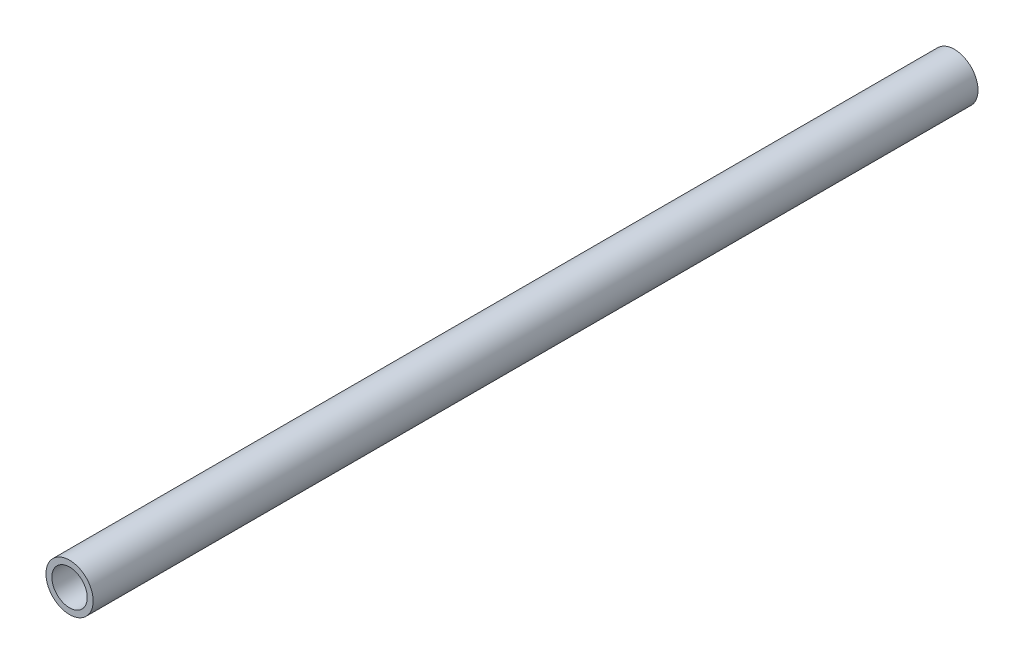
ISO-10303-21;
HEADER;
FILE_DESCRIPTION(('STEP AP214'),'2;1');
FILE_NAME('part.step','',(''),(''),'','','');
FILE_SCHEMA(('AUTOMOTIVE_DESIGN { 1 0 10303 214 1 1 1 1 }'));
ENDSEC;
DATA;
#1=APPLICATION_CONTEXT('core data for automotive mechanical design processes');
#2=APPLICATION_PROTOCOL_DEFINITION('international standard','automotive_design',2000,#1);
#3=PRODUCT_CONTEXT('',#1,'mechanical');
#4=PRODUCT('Part','Part','',(#3));
#5=PRODUCT_RELATED_PRODUCT_CATEGORY('part','',(#4));
#6=PRODUCT_DEFINITION_FORMATION('','',#4);
#7=PRODUCT_DEFINITION_CONTEXT('part definition',#1,'design');
#8=PRODUCT_DEFINITION('design','',#6,#7);
#9=PRODUCT_DEFINITION_SHAPE('','',#8);
#10=(LENGTH_UNIT() NAMED_UNIT(*) SI_UNIT(.MILLI.,.METRE.));
#11=(NAMED_UNIT(*) PLANE_ANGLE_UNIT() SI_UNIT($,.RADIAN.));
#12=(NAMED_UNIT(*) SI_UNIT($,.STERADIAN.) SOLID_ANGLE_UNIT());
#13=UNCERTAINTY_MEASURE_WITH_UNIT(LENGTH_MEASURE(1.E-05),#10,'distance_accuracy_value','');
#14=(GEOMETRIC_REPRESENTATION_CONTEXT(3) GLOBAL_UNCERTAINTY_ASSIGNED_CONTEXT((#13)) GLOBAL_UNIT_ASSIGNED_CONTEXT((#10,
#11,#12)) REPRESENTATION_CONTEXT('',''));
#15=CARTESIAN_POINT('',(0.,0.,0.));
#16=DIRECTION('',(0.,0.,1.));
#17=DIRECTION('',(1.,0.,0.));
#18=AXIS2_PLACEMENT_3D('',#15,#16,#17);
#19=CARTESIAN_POINT('',(0.,0.,150.));
#20=DIRECTION('',(0.,0.,1.));
#21=DIRECTION('',(1.,0.,0.));
#22=AXIS2_PLACEMENT_3D('',#19,#20,#21);
#23=PLANE('',#22);
#24=CARTESIAN_POINT('',(0.,0.,150.));
#25=DIRECTION('',(0.,0.,1.));
#26=DIRECTION('',(1.,0.,0.));
#27=AXIS2_PLACEMENT_3D('',#24,#25,#26);
#28=CIRCLE('',#27,4.);
#29=CARTESIAN_POINT('',(4.,0.,150.));
#30=VERTEX_POINT('',#29);
#31=EDGE_CURVE('E10',#30,#30,#28,.T.);
#32=ORIENTED_EDGE('',*,*,#31,.T.);
#33=EDGE_LOOP('',(#32));
#34=FACE_BOUND('',#33,.T.);
#35=CARTESIAN_POINT('',(0.,0.,150.));
#36=DIRECTION('',(0.,0.,1.));
#37=DIRECTION('',(1.,0.,0.));
#38=AXIS2_PLACEMENT_3D('',#35,#36,#37);
#39=CIRCLE('',#38,3.);
#40=CARTESIAN_POINT('',(3.,0.,150.));
#41=VERTEX_POINT('',#40);
#42=EDGE_CURVE('E49',#41,#41,#39,.T.);
#43=ORIENTED_EDGE('',*,*,#42,.F.);
#44=EDGE_LOOP('',(#43));
#45=FACE_BOUND('',#44,.T.);
#46=ADVANCED_FACE('F38',(#34,#45),#23,.T.);
#47=CARTESIAN_POINT('',(0.,0.,0.));
#48=DIRECTION('',(0.,0.,1.));
#49=DIRECTION('',(1.,0.,0.));
#50=AXIS2_PLACEMENT_3D('',#47,#48,#49);
#51=PLANE('',#50);
#52=CARTESIAN_POINT('',(0.,0.,0.));
#53=DIRECTION('',(0.,0.,1.));
#54=DIRECTION('',(1.,0.,0.));
#55=AXIS2_PLACEMENT_3D('',#52,#53,#54);
#56=CIRCLE('',#55,4.);
#57=CARTESIAN_POINT('',(4.,0.,0.));
#58=VERTEX_POINT('',#57);
#59=EDGE_CURVE('E42',#58,#58,#56,.T.);
#60=ORIENTED_EDGE('',*,*,#59,.F.);
#61=EDGE_LOOP('',(#60));
#62=FACE_BOUND('',#61,.T.);
#63=CARTESIAN_POINT('',(0.,0.,0.));
#64=DIRECTION('',(0.,0.,1.));
#65=DIRECTION('',(1.,0.,0.));
#66=AXIS2_PLACEMENT_3D('',#63,#64,#65);
#67=CIRCLE('',#66,3.);
#68=CARTESIAN_POINT('',(3.,0.,0.));
#69=VERTEX_POINT('',#68);
#70=EDGE_CURVE('E51',#69,#69,#67,.T.);
#71=ORIENTED_EDGE('',*,*,#70,.T.);
#72=EDGE_LOOP('',(#71));
#73=FACE_BOUND('',#72,.T.);
#74=ADVANCED_FACE('F61',(#62,#73),#51,.F.);
#75=CARTESIAN_POINT('',(0.,0.,150.));
#76=DIRECTION('',(0.,0.,-1.));
#77=DIRECTION('',(-1.,0.,0.));
#78=AXIS2_PLACEMENT_3D('',#75,#76,#77);
#79=CYLINDRICAL_SURFACE('',#78,4.);
#80=ORIENTED_EDGE('',*,*,#31,.F.);
#81=EDGE_LOOP('',(#80));
#82=FACE_BOUND('',#81,.T.);
#83=ORIENTED_EDGE('',*,*,#59,.T.);
#84=EDGE_LOOP('',(#83));
#85=FACE_BOUND('',#84,.T.);
#86=ADVANCED_FACE('F40',(#82,#85),#79,.T.);
#87=CARTESIAN_POINT('',(0.,0.,150.));
#88=DIRECTION('',(0.,0.,-1.));
#89=DIRECTION('',(-1.,0.,0.));
#90=AXIS2_PLACEMENT_3D('',#87,#88,#89);
#91=CYLINDRICAL_SURFACE('',#90,3.);
#92=ORIENTED_EDGE('',*,*,#42,.T.);
#93=EDGE_LOOP('',(#92));
#94=FACE_BOUND('',#93,.T.);
#95=ORIENTED_EDGE('',*,*,#70,.F.);
#96=EDGE_LOOP('',(#95));
#97=FACE_BOUND('',#96,.T.);
#98=ADVANCED_FACE('F57',(#94,#97),#91,.F.);
#99=CLOSED_SHELL('',(#46,#74,#86,#98));
#100=MANIFOLD_SOLID_BREP('B2',#99);
#101=ADVANCED_BREP_SHAPE_REPRESENTATION('',(#18,#100),#14);
#102=SHAPE_DEFINITION_REPRESENTATION(#9,#101);
ENDSEC;
END-ISO-10303-21;
